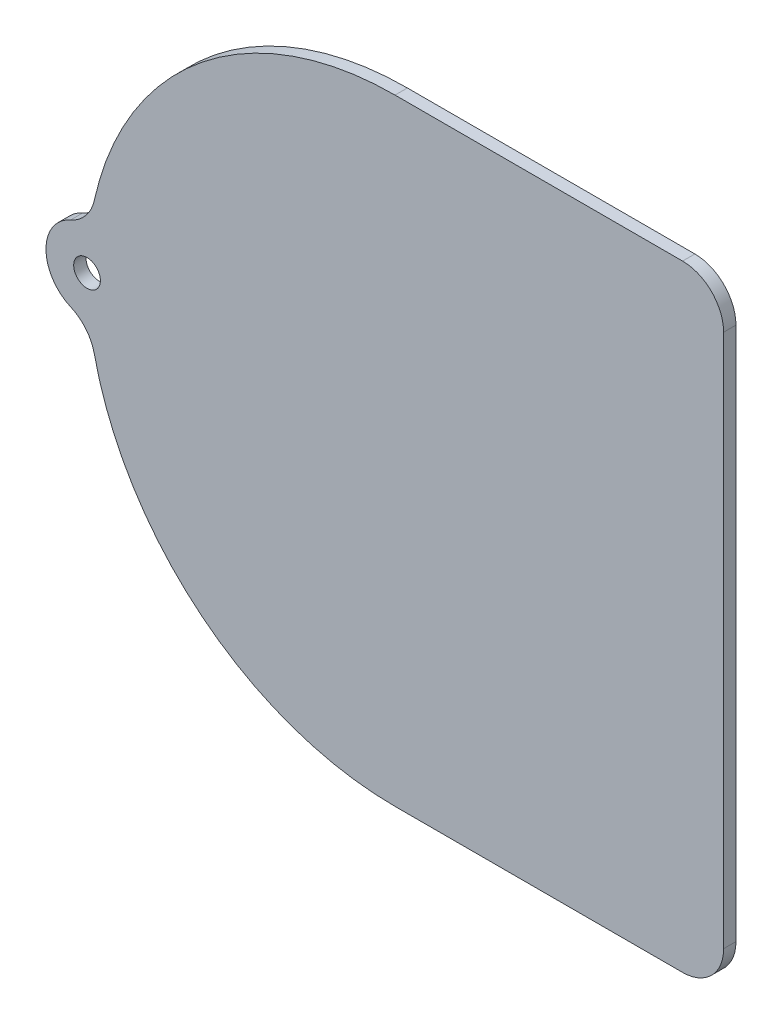
ISO-10303-21;
HEADER;
FILE_DESCRIPTION(('STEP AP214'),'2;1');
FILE_NAME('part.step','',(''),(''),'','','');
FILE_SCHEMA(('AUTOMOTIVE_DESIGN { 1 0 10303 214 1 1 1 1 }'));
ENDSEC;
DATA;
#1=APPLICATION_CONTEXT('core data for automotive mechanical design processes');
#2=APPLICATION_PROTOCOL_DEFINITION('international standard','automotive_design',2000,#1);
#3=PRODUCT_CONTEXT('',#1,'mechanical');
#4=PRODUCT('Part','Part','',(#3));
#5=PRODUCT_RELATED_PRODUCT_CATEGORY('part','',(#4));
#6=PRODUCT_DEFINITION_FORMATION('','',#4);
#7=PRODUCT_DEFINITION_CONTEXT('part definition',#1,'design');
#8=PRODUCT_DEFINITION('design','',#6,#7);
#9=PRODUCT_DEFINITION_SHAPE('','',#8);
#10=(LENGTH_UNIT() NAMED_UNIT(*) SI_UNIT(.MILLI.,.METRE.));
#11=(NAMED_UNIT(*) PLANE_ANGLE_UNIT() SI_UNIT($,.RADIAN.));
#12=(NAMED_UNIT(*) SI_UNIT($,.STERADIAN.) SOLID_ANGLE_UNIT());
#13=UNCERTAINTY_MEASURE_WITH_UNIT(LENGTH_MEASURE(1.E-05),#10,'distance_accuracy_value','');
#14=(GEOMETRIC_REPRESENTATION_CONTEXT(3) GLOBAL_UNCERTAINTY_ASSIGNED_CONTEXT((#13)) GLOBAL_UNIT_ASSIGNED_CONTEXT((#10,
#11,#12)) REPRESENTATION_CONTEXT('',''));
#15=CARTESIAN_POINT('',(0.,0.,0.));
#16=DIRECTION('',(0.,0.,1.));
#17=DIRECTION('',(1.,0.,0.));
#18=AXIS2_PLACEMENT_3D('',#15,#16,#17);
#19=CARTESIAN_POINT('',(70.,65.,3.));
#20=DIRECTION('',(0.,0.,-1.));
#21=DIRECTION('',(-1.,0.,0.));
#22=AXIS2_PLACEMENT_3D('',#19,#20,#21);
#23=PLANE('',#22);
#24=CARTESIAN_POINT('',(70.,65.,3.));
#25=DIRECTION('',(0.,0.,1.));
#26=DIRECTION('',(-1.,0.,0.));
#27=AXIS2_PLACEMENT_3D('',#24,#25,#26);
#28=CIRCLE('',#27,9.99999999999999);
#29=CARTESIAN_POINT('',(80.,65.,3.));
#30=VERTEX_POINT('',#29);
#31=CARTESIAN_POINT('',(70.,75.,3.));
#32=VERTEX_POINT('',#31);
#33=EDGE_CURVE('E161',#30,#32,#28,.T.);
#34=ORIENTED_EDGE('',*,*,#33,.T.);
#35=DIRECTION('',(-1.,0.,0.));
#36=VECTOR('',#35,1.);
#37=CARTESIAN_POINT('',(0.,75.,3.));
#38=LINE('',#37,#36);
#39=CARTESIAN_POINT('',(0.,75.,3.));
#40=VERTEX_POINT('',#39);
#41=EDGE_CURVE('E99',#32,#40,#38,.T.);
#42=ORIENTED_EDGE('',*,*,#41,.T.);
#43=CARTESIAN_POINT('',(0.,0.,3.));
#44=DIRECTION('',(0.,0.,1.));
#45=DIRECTION('',(1.,0.,0.));
#46=AXIS2_PLACEMENT_3D('',#43,#44,#45);
#47=CIRCLE('',#46,75.);
#48=CARTESIAN_POINT('',(-73.235294117647,16.1737965704324,3.));
#49=VERTEX_POINT('',#48);
#50=EDGE_CURVE('E182',#40,#49,#47,.T.);
#51=ORIENTED_EDGE('',*,*,#50,.T.);
#52=CARTESIAN_POINT('',(-83.,18.3303027798234,3.));
#53=DIRECTION('',(0.,0.,-1.));
#54=DIRECTION('',(1.,0.,0.));
#55=AXIS2_PLACEMENT_3D('',#52,#53,#54);
#56=CIRCLE('',#55,9.99999999999999);
#57=CARTESIAN_POINT('',(-79.,9.16515138991169,3.));
#58=VERTEX_POINT('',#57);
#59=EDGE_CURVE('E201',#49,#58,#56,.T.);
#60=ORIENTED_EDGE('',*,*,#59,.T.);
#61=CARTESIAN_POINT('',(-75.,0.,3.));
#62=DIRECTION('',(0.,0.,1.));
#63=DIRECTION('',(1.,0.,0.));
#64=AXIS2_PLACEMENT_3D('',#61,#62,#63);
#65=CIRCLE('',#64,10.);
#66=CARTESIAN_POINT('',(-79.,-9.16515138991168,3.));
#67=VERTEX_POINT('',#66);
#68=EDGE_CURVE('E198',#58,#67,#65,.T.);
#69=ORIENTED_EDGE('',*,*,#68,.T.);
#70=CARTESIAN_POINT('',(-83.,-18.3303027798234,3.));
#71=DIRECTION('',(0.,0.,-1.));
#72=DIRECTION('',(1.,0.,0.));
#73=AXIS2_PLACEMENT_3D('',#70,#71,#72);
#74=CIRCLE('',#73,9.99999999999999);
#75=CARTESIAN_POINT('',(-73.235294117647,-16.1737965704324,3.));
#76=VERTEX_POINT('',#75);
#77=EDGE_CURVE('E200',#67,#76,#74,.T.);
#78=ORIENTED_EDGE('',*,*,#77,.T.);
#79=CARTESIAN_POINT('',(0.,0.,3.));
#80=DIRECTION('',(0.,0.,1.));
#81=DIRECTION('',(1.,0.,0.));
#82=AXIS2_PLACEMENT_3D('',#79,#80,#81);
#83=CIRCLE('',#82,75.);
#84=CARTESIAN_POINT('',(0.,-75.,3.));
#85=VERTEX_POINT('',#84);
#86=EDGE_CURVE('E124',#76,#85,#83,.T.);
#87=ORIENTED_EDGE('',*,*,#86,.T.);
#88=DIRECTION('',(1.,0.,0.));
#89=VECTOR('',#88,1.);
#90=CARTESIAN_POINT('',(70.,-75.,3.));
#91=LINE('',#90,#89);
#92=CARTESIAN_POINT('',(70.,-75.,3.));
#93=VERTEX_POINT('',#92);
#94=EDGE_CURVE('E118',#85,#93,#91,.T.);
#95=ORIENTED_EDGE('',*,*,#94,.T.);
#96=CARTESIAN_POINT('',(70.,-65.,3.));
#97=DIRECTION('',(0.,0.,1.));
#98=DIRECTION('',(-1.,0.,0.));
#99=AXIS2_PLACEMENT_3D('',#96,#97,#98);
#100=CIRCLE('',#99,9.99999999999999);
#101=CARTESIAN_POINT('',(80.,-65.,3.));
#102=VERTEX_POINT('',#101);
#103=EDGE_CURVE('E122',#93,#102,#100,.T.);
#104=ORIENTED_EDGE('',*,*,#103,.T.);
#105=DIRECTION('',(0.,1.,0.));
#106=VECTOR('',#105,1.);
#107=CARTESIAN_POINT('',(80.,65.,3.));
#108=LINE('',#107,#106);
#109=EDGE_CURVE('E50',#102,#30,#108,.T.);
#110=ORIENTED_EDGE('',*,*,#109,.T.);
#111=EDGE_LOOP('',(#34,#42,#51,#60,#69,#78,#87,#95,#104,#110));
#112=FACE_BOUND('',#111,.T.);
#113=CARTESIAN_POINT('',(-75.,0.,3.));
#114=DIRECTION('',(0.,0.,1.));
#115=DIRECTION('',(1.,0.,0.));
#116=AXIS2_PLACEMENT_3D('',#113,#114,#115);
#117=CIRCLE('',#116,3.25000000000001);
#118=CARTESIAN_POINT('',(-71.75,0.,3.));
#119=VERTEX_POINT('',#118);
#120=EDGE_CURVE('E146',#119,#119,#117,.T.);
#121=ORIENTED_EDGE('',*,*,#120,.F.);
#122=EDGE_LOOP('',(#121));
#123=FACE_BOUND('',#122,.T.);
#124=ADVANCED_FACE('F33',(#112,#123),#23,.F.);
#125=CARTESIAN_POINT('',(70.,65.,0.));
#126=DIRECTION('',(0.,0.,-1.));
#127=DIRECTION('',(-1.,0.,0.));
#128=AXIS2_PLACEMENT_3D('',#125,#126,#127);
#129=PLANE('',#128);
#130=CARTESIAN_POINT('',(70.,65.,0.));
#131=DIRECTION('',(0.,0.,1.));
#132=DIRECTION('',(-1.,0.,0.));
#133=AXIS2_PLACEMENT_3D('',#130,#131,#132);
#134=CIRCLE('',#133,9.99999999999999);
#135=CARTESIAN_POINT('',(80.,65.,0.));
#136=VERTEX_POINT('',#135);
#137=CARTESIAN_POINT('',(70.,75.,0.));
#138=VERTEX_POINT('',#137);
#139=EDGE_CURVE('E142',#136,#138,#134,.T.);
#140=ORIENTED_EDGE('',*,*,#139,.F.);
#141=DIRECTION('',(0.,1.,0.));
#142=VECTOR('',#141,1.);
#143=CARTESIAN_POINT('',(80.,65.,0.));
#144=LINE('',#143,#142);
#145=CARTESIAN_POINT('',(80.,-65.,0.));
#146=VERTEX_POINT('',#145);
#147=EDGE_CURVE('E91',#146,#136,#144,.T.);
#148=ORIENTED_EDGE('',*,*,#147,.F.);
#149=CARTESIAN_POINT('',(70.,-65.,0.));
#150=DIRECTION('',(0.,0.,1.));
#151=DIRECTION('',(-1.,0.,0.));
#152=AXIS2_PLACEMENT_3D('',#149,#150,#151);
#153=CIRCLE('',#152,9.99999999999999);
#154=CARTESIAN_POINT('',(70.,-75.,0.));
#155=VERTEX_POINT('',#154);
#156=EDGE_CURVE('E85',#155,#146,#153,.T.);
#157=ORIENTED_EDGE('',*,*,#156,.F.);
#158=DIRECTION('',(1.,0.,0.));
#159=VECTOR('',#158,1.);
#160=CARTESIAN_POINT('',(70.,-75.,0.));
#161=LINE('',#160,#159);
#162=CARTESIAN_POINT('',(0.,-75.,0.));
#163=VERTEX_POINT('',#162);
#164=EDGE_CURVE('E132',#163,#155,#161,.T.);
#165=ORIENTED_EDGE('',*,*,#164,.F.);
#166=CARTESIAN_POINT('',(0.,0.,0.));
#167=DIRECTION('',(0.,0.,1.));
#168=DIRECTION('',(1.,0.,0.));
#169=AXIS2_PLACEMENT_3D('',#166,#167,#168);
#170=CIRCLE('',#169,75.);
#171=CARTESIAN_POINT('',(-73.235294117647,-16.1737965704324,0.));
#172=VERTEX_POINT('',#171);
#173=EDGE_CURVE('E156',#172,#163,#170,.T.);
#174=ORIENTED_EDGE('',*,*,#173,.F.);
#175=CARTESIAN_POINT('',(-83.,-18.3303027798234,0.));
#176=DIRECTION('',(0.,0.,-1.));
#177=DIRECTION('',(1.,0.,0.));
#178=AXIS2_PLACEMENT_3D('',#175,#176,#177);
#179=CIRCLE('',#178,9.99999999999999);
#180=CARTESIAN_POINT('',(-79.,-9.16515138991168,0.));
#181=VERTEX_POINT('',#180);
#182=EDGE_CURVE('E154',#181,#172,#179,.T.);
#183=ORIENTED_EDGE('',*,*,#182,.F.);
#184=CARTESIAN_POINT('',(-75.,0.,0.));
#185=DIRECTION('',(0.,0.,1.));
#186=DIRECTION('',(1.,0.,0.));
#187=AXIS2_PLACEMENT_3D('',#184,#185,#186);
#188=CIRCLE('',#187,10.);
#189=CARTESIAN_POINT('',(-79.,9.16515138991169,0.));
#190=VERTEX_POINT('',#189);
#191=EDGE_CURVE('E152',#190,#181,#188,.T.);
#192=ORIENTED_EDGE('',*,*,#191,.F.);
#193=CARTESIAN_POINT('',(-83.,18.3303027798234,0.));
#194=DIRECTION('',(0.,0.,-1.));
#195=DIRECTION('',(1.,0.,0.));
#196=AXIS2_PLACEMENT_3D('',#193,#194,#195);
#197=CIRCLE('',#196,9.99999999999999);
#198=CARTESIAN_POINT('',(-73.235294117647,16.1737965704324,0.));
#199=VERTEX_POINT('',#198);
#200=EDGE_CURVE('E150',#199,#190,#197,.T.);
#201=ORIENTED_EDGE('',*,*,#200,.F.);
#202=CARTESIAN_POINT('',(0.,0.,0.));
#203=DIRECTION('',(0.,0.,1.));
#204=DIRECTION('',(1.,0.,0.));
#205=AXIS2_PLACEMENT_3D('',#202,#203,#204);
#206=CIRCLE('',#205,75.);
#207=CARTESIAN_POINT('',(0.,75.,0.));
#208=VERTEX_POINT('',#207);
#209=EDGE_CURVE('E148',#208,#199,#206,.T.);
#210=ORIENTED_EDGE('',*,*,#209,.F.);
#211=DIRECTION('',(-1.,0.,0.));
#212=VECTOR('',#211,1.);
#213=CARTESIAN_POINT('',(0.,75.,0.));
#214=LINE('',#213,#212);
#215=EDGE_CURVE('E145',#138,#208,#214,.T.);
#216=ORIENTED_EDGE('',*,*,#215,.F.);
#217=EDGE_LOOP('',(#140,#148,#157,#165,#174,#183,#192,#201,#210,#216));
#218=FACE_BOUND('',#217,.T.);
#219=CARTESIAN_POINT('',(-75.,0.,0.));
#220=DIRECTION('',(0.,0.,1.));
#221=DIRECTION('',(1.,0.,0.));
#222=AXIS2_PLACEMENT_3D('',#219,#220,#221);
#223=CIRCLE('',#222,3.25000000000001);
#224=CARTESIAN_POINT('',(-71.75,0.,0.));
#225=VERTEX_POINT('',#224);
#226=EDGE_CURVE('E209',#225,#225,#223,.T.);
#227=ORIENTED_EDGE('',*,*,#226,.T.);
#228=EDGE_LOOP('',(#227));
#229=FACE_BOUND('',#228,.T.);
#230=ADVANCED_FACE('F186',(#218,#229),#129,.T.);
#231=CARTESIAN_POINT('',(70.,65.,3.));
#232=DIRECTION('',(0.,0.,-1.));
#233=DIRECTION('',(-1.,0.,0.));
#234=AXIS2_PLACEMENT_3D('',#231,#232,#233);
#235=CYLINDRICAL_SURFACE('',#234,9.99999999999999);
#236=ORIENTED_EDGE('',*,*,#139,.T.);
#237=DIRECTION('',(0.,0.,-1.));
#238=VECTOR('',#237,1.);
#239=CARTESIAN_POINT('',(70.,75.,3.));
#240=LINE('',#239,#238);
#241=EDGE_CURVE('E11',#32,#138,#240,.T.);
#242=ORIENTED_EDGE('',*,*,#241,.F.);
#243=ORIENTED_EDGE('',*,*,#33,.F.);
#244=DIRECTION('',(0.,0.,-1.));
#245=VECTOR('',#244,1.);
#246=CARTESIAN_POINT('',(80.,65.,3.));
#247=LINE('',#246,#245);
#248=EDGE_CURVE('E138',#30,#136,#247,.T.);
#249=ORIENTED_EDGE('',*,*,#248,.T.);
#250=EDGE_LOOP('',(#236,#242,#243,#249));
#251=FACE_BOUND('',#250,.T.);
#252=ADVANCED_FACE('F35',(#251),#235,.T.);
#253=CARTESIAN_POINT('',(0.,75.,3.));
#254=DIRECTION('',(0.,-1.,0.));
#255=DIRECTION('',(0.,0.,-1.));
#256=AXIS2_PLACEMENT_3D('',#253,#254,#255);
#257=PLANE('',#256);
#258=ORIENTED_EDGE('',*,*,#215,.T.);
#259=DIRECTION('',(0.,0.,-1.));
#260=VECTOR('',#259,1.);
#261=CARTESIAN_POINT('',(0.,75.,3.));
#262=LINE('',#261,#260);
#263=EDGE_CURVE('E42',#40,#208,#262,.T.);
#264=ORIENTED_EDGE('',*,*,#263,.F.);
#265=ORIENTED_EDGE('',*,*,#41,.F.);
#266=ORIENTED_EDGE('',*,*,#241,.T.);
#267=EDGE_LOOP('',(#258,#264,#265,#266));
#268=FACE_BOUND('',#267,.T.);
#269=ADVANCED_FACE('F245',(#268),#257,.F.);
#270=CARTESIAN_POINT('',(0.,0.,3.));
#271=DIRECTION('',(0.,0.,-1.));
#272=DIRECTION('',(-1.,0.,0.));
#273=AXIS2_PLACEMENT_3D('',#270,#271,#272);
#274=CYLINDRICAL_SURFACE('',#273,75.);
#275=ORIENTED_EDGE('',*,*,#209,.T.);
#276=DIRECTION('',(0.,0.,-1.));
#277=VECTOR('',#276,1.);
#278=CARTESIAN_POINT('',(-73.235294117647,16.1737965704324,3.));
#279=LINE('',#278,#277);
#280=EDGE_CURVE('E174',#49,#199,#279,.T.);
#281=ORIENTED_EDGE('',*,*,#280,.F.);
#282=ORIENTED_EDGE('',*,*,#50,.F.);
#283=ORIENTED_EDGE('',*,*,#263,.T.);
#284=EDGE_LOOP('',(#275,#281,#282,#283));
#285=FACE_BOUND('',#284,.T.);
#286=ADVANCED_FACE('F180',(#285),#274,.T.);
#287=CARTESIAN_POINT('',(-83.,18.3303027798234,3.));
#288=DIRECTION('',(0.,0.,-1.));
#289=DIRECTION('',(-1.,0.,0.));
#290=AXIS2_PLACEMENT_3D('',#287,#288,#289);
#291=CYLINDRICAL_SURFACE('',#290,9.99999999999999);
#292=ORIENTED_EDGE('',*,*,#200,.T.);
#293=DIRECTION('',(0.,0.,-1.));
#294=VECTOR('',#293,1.);
#295=CARTESIAN_POINT('',(-79.,9.16515138991169,3.));
#296=LINE('',#295,#294);
#297=EDGE_CURVE('E171',#58,#190,#296,.T.);
#298=ORIENTED_EDGE('',*,*,#297,.F.);
#299=ORIENTED_EDGE('',*,*,#59,.F.);
#300=ORIENTED_EDGE('',*,*,#280,.T.);
#301=EDGE_LOOP('',(#292,#298,#299,#300));
#302=FACE_BOUND('',#301,.T.);
#303=ADVANCED_FACE('F192',(#302),#291,.F.);
#304=CARTESIAN_POINT('',(-75.,0.,3.));
#305=DIRECTION('',(0.,0.,-1.));
#306=DIRECTION('',(-1.,0.,0.));
#307=AXIS2_PLACEMENT_3D('',#304,#305,#306);
#308=CYLINDRICAL_SURFACE('',#307,10.);
#309=ORIENTED_EDGE('',*,*,#191,.T.);
#310=DIRECTION('',(0.,0.,-1.));
#311=VECTOR('',#310,1.);
#312=CARTESIAN_POINT('',(-79.,-9.16515138991168,3.));
#313=LINE('',#312,#311);
#314=EDGE_CURVE('E168',#67,#181,#313,.T.);
#315=ORIENTED_EDGE('',*,*,#314,.F.);
#316=ORIENTED_EDGE('',*,*,#68,.F.);
#317=ORIENTED_EDGE('',*,*,#297,.T.);
#318=EDGE_LOOP('',(#309,#315,#316,#317));
#319=FACE_BOUND('',#318,.T.);
#320=ADVANCED_FACE('F196',(#319),#308,.T.);
#321=CARTESIAN_POINT('',(-83.,-18.3303027798234,3.));
#322=DIRECTION('',(0.,0.,-1.));
#323=DIRECTION('',(-1.,0.,0.));
#324=AXIS2_PLACEMENT_3D('',#321,#322,#323);
#325=CYLINDRICAL_SURFACE('',#324,9.99999999999999);
#326=ORIENTED_EDGE('',*,*,#182,.T.);
#327=DIRECTION('',(0.,0.,-1.));
#328=VECTOR('',#327,1.);
#329=CARTESIAN_POINT('',(-73.235294117647,-16.1737965704324,3.));
#330=LINE('',#329,#328);
#331=EDGE_CURVE('E165',#76,#172,#330,.T.);
#332=ORIENTED_EDGE('',*,*,#331,.F.);
#333=ORIENTED_EDGE('',*,*,#77,.F.);
#334=ORIENTED_EDGE('',*,*,#314,.T.);
#335=EDGE_LOOP('',(#326,#332,#333,#334));
#336=FACE_BOUND('',#335,.T.);
#337=ADVANCED_FACE('F235',(#336),#325,.F.);
#338=CARTESIAN_POINT('',(0.,0.,3.));
#339=DIRECTION('',(0.,0.,-1.));
#340=DIRECTION('',(-1.,0.,0.));
#341=AXIS2_PLACEMENT_3D('',#338,#339,#340);
#342=CYLINDRICAL_SURFACE('',#341,75.);
#343=ORIENTED_EDGE('',*,*,#173,.T.);
#344=DIRECTION('',(0.,0.,-1.));
#345=VECTOR('',#344,1.);
#346=CARTESIAN_POINT('',(0.,-75.,3.));
#347=LINE('',#346,#345);
#348=EDGE_CURVE('E133',#85,#163,#347,.T.);
#349=ORIENTED_EDGE('',*,*,#348,.F.);
#350=ORIENTED_EDGE('',*,*,#86,.F.);
#351=ORIENTED_EDGE('',*,*,#331,.T.);
#352=EDGE_LOOP('',(#343,#349,#350,#351));
#353=FACE_BOUND('',#352,.T.);
#354=ADVANCED_FACE('F232',(#353),#342,.T.);
#355=CARTESIAN_POINT('',(70.,-75.,3.));
#356=DIRECTION('',(0.,1.,0.));
#357=DIRECTION('',(0.,0.,1.));
#358=AXIS2_PLACEMENT_3D('',#355,#356,#357);
#359=PLANE('',#358);
#360=ORIENTED_EDGE('',*,*,#164,.T.);
#361=DIRECTION('',(0.,0.,-1.));
#362=VECTOR('',#361,1.);
#363=CARTESIAN_POINT('',(70.,-75.,3.));
#364=LINE('',#363,#362);
#365=EDGE_CURVE('E129',#93,#155,#364,.T.);
#366=ORIENTED_EDGE('',*,*,#365,.F.);
#367=ORIENTED_EDGE('',*,*,#94,.F.);
#368=ORIENTED_EDGE('',*,*,#348,.T.);
#369=EDGE_LOOP('',(#360,#366,#367,#368));
#370=FACE_BOUND('',#369,.T.);
#371=ADVANCED_FACE('F130',(#370),#359,.F.);
#372=CARTESIAN_POINT('',(70.,-65.,3.));
#373=DIRECTION('',(0.,0.,-1.));
#374=DIRECTION('',(-1.,0.,0.));
#375=AXIS2_PLACEMENT_3D('',#372,#373,#374);
#376=CYLINDRICAL_SURFACE('',#375,9.99999999999999);
#377=ORIENTED_EDGE('',*,*,#156,.T.);
#378=DIRECTION('',(0.,0.,-1.));
#379=VECTOR('',#378,1.);
#380=CARTESIAN_POINT('',(80.,-65.,3.));
#381=LINE('',#380,#379);
#382=EDGE_CURVE('E134',#102,#146,#381,.T.);
#383=ORIENTED_EDGE('',*,*,#382,.F.);
#384=ORIENTED_EDGE('',*,*,#103,.F.);
#385=ORIENTED_EDGE('',*,*,#365,.T.);
#386=EDGE_LOOP('',(#377,#383,#384,#385));
#387=FACE_BOUND('',#386,.T.);
#388=ADVANCED_FACE('F136',(#387),#376,.T.);
#389=CARTESIAN_POINT('',(80.,65.,3.));
#390=DIRECTION('',(-1.,0.,0.));
#391=DIRECTION('',(0.,0.,1.));
#392=AXIS2_PLACEMENT_3D('',#389,#390,#391);
#393=PLANE('',#392);
#394=ORIENTED_EDGE('',*,*,#147,.T.);
#395=ORIENTED_EDGE('',*,*,#248,.F.);
#396=ORIENTED_EDGE('',*,*,#109,.F.);
#397=ORIENTED_EDGE('',*,*,#382,.T.);
#398=EDGE_LOOP('',(#394,#395,#396,#397));
#399=FACE_BOUND('',#398,.T.);
#400=ADVANCED_FACE('F225',(#399),#393,.F.);
#401=CARTESIAN_POINT('',(-75.,0.,3.));
#402=DIRECTION('',(0.,0.,-1.));
#403=DIRECTION('',(-1.,0.,0.));
#404=AXIS2_PLACEMENT_3D('',#401,#402,#403);
#405=CYLINDRICAL_SURFACE('',#404,3.25000000000001);
#406=ORIENTED_EDGE('',*,*,#120,.T.);
#407=EDGE_LOOP('',(#406));
#408=FACE_BOUND('',#407,.T.);
#409=ORIENTED_EDGE('',*,*,#226,.F.);
#410=EDGE_LOOP('',(#409));
#411=FACE_BOUND('',#410,.T.);
#412=ADVANCED_FACE('F215',(#408,#411),#405,.F.);
#413=CLOSED_SHELL('',(#124,#230,#252,#269,#286,#303,#320,#337,#354,#371,#388,#400,#412));
#414=MANIFOLD_SOLID_BREP('B2',#413);
#415=ADVANCED_BREP_SHAPE_REPRESENTATION('',(#18,#414),#14);
#416=SHAPE_DEFINITION_REPRESENTATION(#9,#415);
ENDSEC;
END-ISO-10303-21;
